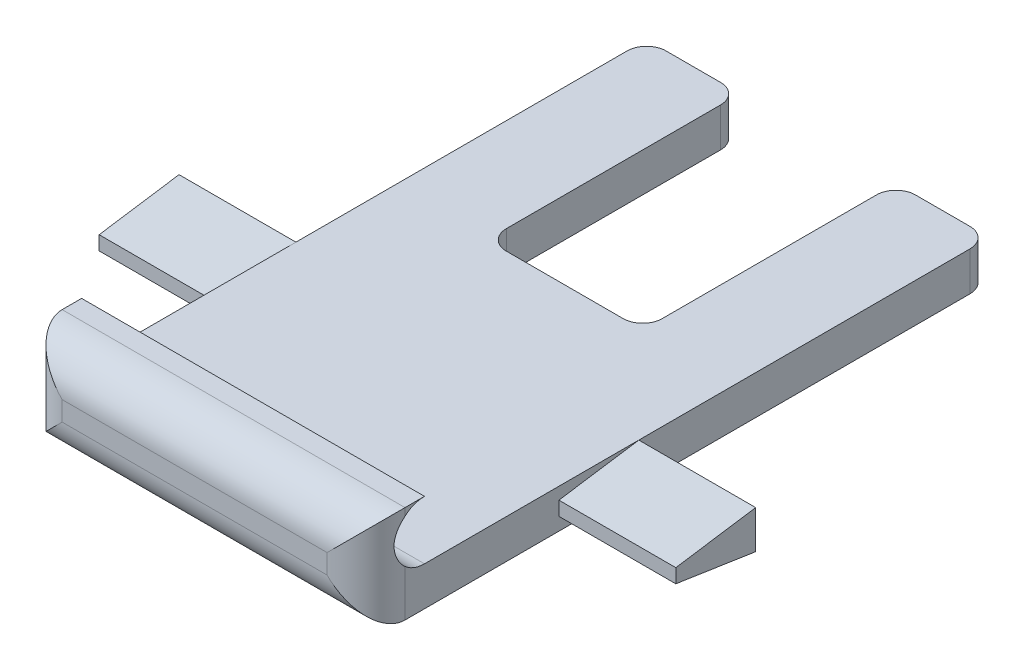
ISO-10303-21;
HEADER;
FILE_DESCRIPTION(('STEP AP214'),'2;1');
FILE_NAME('part.step','',(''),(''),'','','');
FILE_SCHEMA(('AUTOMOTIVE_DESIGN { 1 0 10303 214 1 1 1 1 }'));
ENDSEC;
DATA;
#1=APPLICATION_CONTEXT('core data for automotive mechanical design processes');
#2=APPLICATION_PROTOCOL_DEFINITION('international standard','automotive_design',2000,#1);
#3=PRODUCT_CONTEXT('',#1,'mechanical');
#4=PRODUCT('Part','Part','',(#3));
#5=PRODUCT_RELATED_PRODUCT_CATEGORY('part','',(#4));
#6=PRODUCT_DEFINITION_FORMATION('','',#4);
#7=PRODUCT_DEFINITION_CONTEXT('part definition',#1,'design');
#8=PRODUCT_DEFINITION('design','',#6,#7);
#9=PRODUCT_DEFINITION_SHAPE('','',#8);
#10=(LENGTH_UNIT() NAMED_UNIT(*) SI_UNIT(.MILLI.,.METRE.));
#11=(NAMED_UNIT(*) PLANE_ANGLE_UNIT() SI_UNIT($,.RADIAN.));
#12=(NAMED_UNIT(*) SI_UNIT($,.STERADIAN.) SOLID_ANGLE_UNIT());
#13=UNCERTAINTY_MEASURE_WITH_UNIT(LENGTH_MEASURE(1.E-05),#10,'distance_accuracy_value','');
#14=(GEOMETRIC_REPRESENTATION_CONTEXT(3) GLOBAL_UNCERTAINTY_ASSIGNED_CONTEXT((#13)) GLOBAL_UNIT_ASSIGNED_CONTEXT((#10,
#11,#12)) REPRESENTATION_CONTEXT('',''));
#15=CARTESIAN_POINT('',(0.,0.,0.));
#16=DIRECTION('',(0.,0.,1.));
#17=DIRECTION('',(1.,0.,0.));
#18=AXIS2_PLACEMENT_3D('',#15,#16,#17);
#19=CARTESIAN_POINT('',(0.,10.,0.));
#20=DIRECTION('',(1.,0.,0.));
#21=DIRECTION('',(0.,0.,-1.));
#22=AXIS2_PLACEMENT_3D('',#19,#20,#21);
#23=PLANE('',#22);
#24=DIRECTION('',(0.,0.149519617257155,-0.988758759281188));
#25=VECTOR('',#24,1.);
#26=CARTESIAN_POINT('',(0.,10.,-70.));
#27=LINE('',#26,#25);
#28=CARTESIAN_POINT('',(0.,6.9,-49.5));
#29=VERTEX_POINT('',#28);
#30=CARTESIAN_POINT('',(0.,10.,-70.));
#31=VERTEX_POINT('',#30);
#32=EDGE_CURVE('E228',#29,#31,#27,.T.);
#33=ORIENTED_EDGE('',*,*,#32,.F.);
#34=DIRECTION('',(0.,1.,0.));
#35=VECTOR('',#34,1.);
#36=CARTESIAN_POINT('',(0.,6.9,-49.5));
#37=LINE('',#36,#35);
#38=CARTESIAN_POINT('',(0.,3.3,-49.5));
#39=VERTEX_POINT('',#38);
#40=EDGE_CURVE('E262',#39,#29,#37,.T.);
#41=ORIENTED_EDGE('',*,*,#40,.F.);
#42=DIRECTION('',(0.,0.149519617257155,0.988758759281188));
#43=VECTOR('',#42,1.);
#44=CARTESIAN_POINT('',(0.,3.3,-49.5));
#45=LINE('',#44,#43);
#46=CARTESIAN_POINT('',(0.,0.200000000000001,-70.));
#47=VERTEX_POINT('',#46);
#48=EDGE_CURVE('E56',#47,#39,#45,.T.);
#49=ORIENTED_EDGE('',*,*,#48,.F.);
#50=DIRECTION('',(0.,-1.,0.));
#51=VECTOR('',#50,1.);
#52=CARTESIAN_POINT('',(0.,10.,-70.));
#53=LINE('',#52,#51);
#54=EDGE_CURVE('E271',#31,#47,#53,.T.);
#55=ORIENTED_EDGE('',*,*,#54,.F.);
#56=DIRECTION('',(0.,0.,1.));
#57=VECTOR('',#56,1.);
#58=CARTESIAN_POINT('',(0.,10.,0.));
#59=LINE('',#58,#57);
#60=CARTESIAN_POINT('',(0.,10.,-155.));
#61=VERTEX_POINT('',#60);
#62=EDGE_CURVE('E326',#61,#31,#59,.T.);
#63=ORIENTED_EDGE('',*,*,#62,.F.);
#64=DIRECTION('',(0.,-1.,0.));
#65=VECTOR('',#64,1.);
#66=CARTESIAN_POINT('',(0.,10.,-155.));
#67=LINE('',#66,#65);
#68=CARTESIAN_POINT('',(0.,0.,-155.));
#69=VERTEX_POINT('',#68);
#70=EDGE_CURVE('E41',#61,#69,#67,.T.);
#71=ORIENTED_EDGE('',*,*,#70,.T.);
#72=DIRECTION('',(0.,0.,1.));
#73=VECTOR('',#72,1.);
#74=CARTESIAN_POINT('',(0.,0.,0.));
#75=LINE('',#74,#73);
#76=CARTESIAN_POINT('',(0.,0.,-10.));
#77=VERTEX_POINT('',#76);
#78=EDGE_CURVE('E323',#69,#77,#75,.T.);
#79=ORIENTED_EDGE('',*,*,#78,.T.);
#80=DIRECTION('',(0.,-1.,0.));
#81=VECTOR('',#80,1.);
#82=CARTESIAN_POINT('',(0.,10.,-10.));
#83=LINE('',#82,#81);
#84=CARTESIAN_POINT('',(0.,11.9098300562505,-10.));
#85=VERTEX_POINT('',#84);
#86=EDGE_CURVE('E355',#77,#85,#83,.F.);
#87=ORIENTED_EDGE('',*,*,#86,.T.);
#88=CARTESIAN_POINT('',(0.,17.5,-15.));
#89=DIRECTION('',(1.,0.,0.));
#90=DIRECTION('',(0.,0.,-1.));
#91=AXIS2_PLACEMENT_3D('',#88,#89,#90);
#92=CIRCLE('',#91,7.5);
#93=CARTESIAN_POINT('',(0.,10.,-15.));
#94=VERTEX_POINT('',#93);
#95=EDGE_CURVE('E311',#94,#85,#92,.F.);
#96=ORIENTED_EDGE('',*,*,#95,.F.);
#97=EDGE_CURVE('E330',#31,#94,#59,.T.);
#98=ORIENTED_EDGE('',*,*,#97,.F.);
#99=EDGE_LOOP('',(#33,#41,#49,#55,#63,#71,#79,#87,#96,#98));
#100=FACE_BOUND('',#99,.T.);
#101=ADVANCED_FACE('F33',(#100),#23,.F.);
#102=CARTESIAN_POINT('',(0.,10.,-160.));
#103=DIRECTION('',(0.,0.,1.));
#104=DIRECTION('',(1.,0.,0.));
#105=AXIS2_PLACEMENT_3D('',#102,#103,#104);
#106=PLANE('',#105);
#107=DIRECTION('',(-1.,0.,0.));
#108=VECTOR('',#107,1.);
#109=CARTESIAN_POINT('',(0.,10.,-160.));
#110=LINE('',#109,#108);
#111=CARTESIAN_POINT('',(83.,10.,-160.));
#112=VERTEX_POINT('',#111);
#113=CARTESIAN_POINT('',(69.,10.,-160.));
#114=VERTEX_POINT('',#113);
#115=EDGE_CURVE('E335',#112,#114,#110,.T.);
#116=ORIENTED_EDGE('',*,*,#115,.F.);
#117=DIRECTION('',(0.,-1.,0.));
#118=VECTOR('',#117,1.);
#119=CARTESIAN_POINT('',(83.,10.,-160.));
#120=LINE('',#119,#118);
#121=CARTESIAN_POINT('',(83.,0.,-160.));
#122=VERTEX_POINT('',#121);
#123=EDGE_CURVE('E474',#112,#122,#120,.T.);
#124=ORIENTED_EDGE('',*,*,#123,.T.);
#125=DIRECTION('',(-1.,0.,0.));
#126=VECTOR('',#125,1.);
#127=CARTESIAN_POINT('',(0.,0.,-160.));
#128=LINE('',#127,#126);
#129=CARTESIAN_POINT('',(69.,0.,-160.));
#130=VERTEX_POINT('',#129);
#131=EDGE_CURVE('E343',#122,#130,#128,.T.);
#132=ORIENTED_EDGE('',*,*,#131,.T.);
#133=DIRECTION('',(0.,1.,0.));
#134=VECTOR('',#133,1.);
#135=CARTESIAN_POINT('',(69.,10.,-160.));
#136=LINE('',#135,#134);
#137=EDGE_CURVE('E511',#130,#114,#136,.T.);
#138=ORIENTED_EDGE('',*,*,#137,.T.);
#139=EDGE_LOOP('',(#116,#124,#132,#138));
#140=FACE_BOUND('',#139,.T.);
#141=ADVANCED_FACE('F405',(#140),#106,.F.);
#142=CARTESIAN_POINT('',(88.,10.,0.));
#143=DIRECTION('',(-1.,0.,0.));
#144=DIRECTION('',(0.,0.,1.));
#145=AXIS2_PLACEMENT_3D('',#142,#143,#144);
#146=PLANE('',#145);
#147=DIRECTION('',(0.,0.,-1.));
#148=VECTOR('',#147,1.);
#149=CARTESIAN_POINT('',(88.,25.,0.));
#150=LINE('',#149,#148);
#151=CARTESIAN_POINT('',(88.,25.,-10.));
#152=VERTEX_POINT('',#151);
#153=CARTESIAN_POINT('',(88.,25.,-15.));
#154=VERTEX_POINT('',#153);
#155=EDGE_CURVE('E318',#152,#154,#150,.T.);
#156=ORIENTED_EDGE('',*,*,#155,.F.);
#157=DIRECTION('',(0.,-1.,0.));
#158=VECTOR('',#157,1.);
#159=CARTESIAN_POINT('',(88.,10.,-10.));
#160=LINE('',#159,#158);
#161=CARTESIAN_POINT('',(88.,23.0901699437495,-10.));
#162=VERTEX_POINT('',#161);
#163=EDGE_CURVE('E526',#152,#162,#160,.T.);
#164=ORIENTED_EDGE('',*,*,#163,.T.);
#165=CARTESIAN_POINT('',(88.,17.5,-15.));
#166=DIRECTION('',(1.,0.,0.));
#167=DIRECTION('',(0.,0.,-1.));
#168=AXIS2_PLACEMENT_3D('',#165,#166,#167);
#169=CIRCLE('',#168,7.5);
#170=EDGE_CURVE('E306',#154,#162,#169,.T.);
#171=ORIENTED_EDGE('',*,*,#170,.F.);
#172=EDGE_LOOP('',(#156,#164,#171));
#173=FACE_BOUND('',#172,.T.);
#174=ADVANCED_FACE('F395',(#173),#146,.F.);
#175=CARTESIAN_POINT('',(0.,10.,0.));
#176=DIRECTION('',(0.,-1.,0.));
#177=DIRECTION('',(0.,0.,-1.));
#178=AXIS2_PLACEMENT_3D('',#175,#176,#177);
#179=PLANE('',#178);
#180=DIRECTION('',(0.,0.,-1.));
#181=VECTOR('',#180,1.);
#182=CARTESIAN_POINT('',(88.,10.,0.));
#183=LINE('',#182,#181);
#184=CARTESIAN_POINT('',(88.,10.,-15.));
#185=VERTEX_POINT('',#184);
#186=CARTESIAN_POINT('',(88.,10.,-70.));
#187=VERTEX_POINT('',#186);
#188=EDGE_CURVE('E331',#185,#187,#183,.T.);
#189=ORIENTED_EDGE('',*,*,#188,.T.);
#190=CARTESIAN_POINT('',(88.,10.,-155.));
#191=VERTEX_POINT('',#190);
#192=EDGE_CURVE('E329',#187,#191,#183,.T.);
#193=ORIENTED_EDGE('',*,*,#192,.T.);
#194=CARTESIAN_POINT('',(83.,10.,-155.));
#195=DIRECTION('',(0.,-1.,0.));
#196=DIRECTION('',(0.,0.,-1.));
#197=AXIS2_PLACEMENT_3D('',#194,#195,#196);
#198=CIRCLE('',#197,5.);
#199=EDGE_CURVE('E464',#191,#112,#198,.F.);
#200=ORIENTED_EDGE('',*,*,#199,.T.);
#201=ORIENTED_EDGE('',*,*,#115,.T.);
#202=CARTESIAN_POINT('',(69.,10.,-155.));
#203=DIRECTION('',(0.,-1.,0.));
#204=DIRECTION('',(0.,0.,-1.));
#205=AXIS2_PLACEMENT_3D('',#202,#203,#204);
#206=CIRCLE('',#205,5.);
#207=CARTESIAN_POINT('',(64.,10.,-155.));
#208=VERTEX_POINT('',#207);
#209=EDGE_CURVE('E507',#114,#208,#206,.F.);
#210=ORIENTED_EDGE('',*,*,#209,.T.);
#211=DIRECTION('',(0.,0.,1.));
#212=VECTOR('',#211,1.);
#213=CARTESIAN_POINT('',(64.,10.,-160.));
#214=LINE('',#213,#212);
#215=CARTESIAN_POINT('',(64.,10.,-100.));
#216=VERTEX_POINT('',#215);
#217=EDGE_CURVE('E293',#208,#216,#214,.T.);
#218=ORIENTED_EDGE('',*,*,#217,.T.);
#219=CARTESIAN_POINT('',(59.,9.99999999999999,-100.));
#220=DIRECTION('',(0.,-1.,0.));
#221=DIRECTION('',(0.,0.,-1.));
#222=AXIS2_PLACEMENT_3D('',#219,#220,#221);
#223=CIRCLE('',#222,5.);
#224=CARTESIAN_POINT('',(59.,10.,-95.));
#225=VERTEX_POINT('',#224);
#226=EDGE_CURVE('E479',#216,#225,#223,.T.);
#227=ORIENTED_EDGE('',*,*,#226,.T.);
#228=DIRECTION('',(1.,0.,0.));
#229=VECTOR('',#228,1.);
#230=CARTESIAN_POINT('',(24.,10.,-95.));
#231=LINE('',#230,#229);
#232=CARTESIAN_POINT('',(29.,10.,-95.));
#233=VERTEX_POINT('',#232);
#234=EDGE_CURVE('E292',#233,#225,#231,.T.);
#235=ORIENTED_EDGE('',*,*,#234,.F.);
#236=CARTESIAN_POINT('',(29.,9.99999999999999,-100.));
#237=DIRECTION('',(0.,-1.,0.));
#238=DIRECTION('',(0.,0.,-1.));
#239=AXIS2_PLACEMENT_3D('',#236,#237,#238);
#240=CIRCLE('',#239,5.);
#241=CARTESIAN_POINT('',(24.,10.,-100.));
#242=VERTEX_POINT('',#241);
#243=EDGE_CURVE('E483',#233,#242,#240,.T.);
#244=ORIENTED_EDGE('',*,*,#243,.T.);
#245=DIRECTION('',(0.,0.,1.));
#246=VECTOR('',#245,1.);
#247=CARTESIAN_POINT('',(24.,10.,-160.));
#248=LINE('',#247,#246);
#249=CARTESIAN_POINT('',(24.,10.,-155.));
#250=VERTEX_POINT('',#249);
#251=EDGE_CURVE('E288',#250,#242,#248,.T.);
#252=ORIENTED_EDGE('',*,*,#251,.F.);
#253=CARTESIAN_POINT('',(19.,9.99999999999999,-155.));
#254=DIRECTION('',(0.,-1.,0.));
#255=DIRECTION('',(0.,0.,-1.));
#256=AXIS2_PLACEMENT_3D('',#253,#254,#255);
#257=CIRCLE('',#256,5.);
#258=CARTESIAN_POINT('',(19.,10.,-160.));
#259=VERTEX_POINT('',#258);
#260=EDGE_CURVE('E509',#250,#259,#257,.F.);
#261=ORIENTED_EDGE('',*,*,#260,.T.);
#262=CARTESIAN_POINT('',(5.,10.,-160.));
#263=VERTEX_POINT('',#262);
#264=EDGE_CURVE('E334',#259,#263,#110,.T.);
#265=ORIENTED_EDGE('',*,*,#264,.T.);
#266=CARTESIAN_POINT('',(5.,10.,-155.));
#267=DIRECTION('',(0.,-1.,0.));
#268=DIRECTION('',(0.,0.,-1.));
#269=AXIS2_PLACEMENT_3D('',#266,#267,#268);
#270=CIRCLE('',#269,5.);
#271=EDGE_CURVE('E462',#263,#61,#270,.F.);
#272=ORIENTED_EDGE('',*,*,#271,.T.);
#273=ORIENTED_EDGE('',*,*,#62,.T.);
#274=ORIENTED_EDGE('',*,*,#97,.T.);
#275=DIRECTION('',(-1.,0.,0.));
#276=VECTOR('',#275,1.);
#277=CARTESIAN_POINT('',(0.,10.,-15.));
#278=LINE('',#277,#276);
#279=EDGE_CURVE('E314',#185,#94,#278,.T.);
#280=ORIENTED_EDGE('',*,*,#279,.F.);
#281=EDGE_LOOP('',(#189,#193,#200,#201,#210,#218,#227,#235,#244,#252,#261,#265,#272,#273,#274,#280));
#282=FACE_BOUND('',#281,.T.);
#283=ADVANCED_FACE('F391',(#282),#179,.F.);
#284=CARTESIAN_POINT('',(0.,23.0901699437495,-10.));
#285=VERTEX_POINT('',#284);
#286=CARTESIAN_POINT('',(0.,25.,-15.));
#287=VERTEX_POINT('',#286);
#288=EDGE_CURVE('E309',#285,#287,#92,.F.);
#289=ORIENTED_EDGE('',*,*,#288,.F.);
#290=DIRECTION('',(0.,-1.,0.));
#291=VECTOR('',#290,1.);
#292=CARTESIAN_POINT('',(0.,10.,-10.));
#293=LINE('',#292,#291);
#294=CARTESIAN_POINT('',(0.,25.,-10.));
#295=VERTEX_POINT('',#294);
#296=EDGE_CURVE('E353',#285,#295,#293,.F.);
#297=ORIENTED_EDGE('',*,*,#296,.T.);
#298=DIRECTION('',(0.,0.,1.));
#299=VECTOR('',#298,1.);
#300=CARTESIAN_POINT('',(0.,25.,0.));
#301=LINE('',#300,#299);
#302=EDGE_CURVE('E315',#287,#295,#301,.T.);
#303=ORIENTED_EDGE('',*,*,#302,.F.);
#304=EDGE_LOOP('',(#289,#297,#303));
#305=FACE_BOUND('',#304,.T.);
#306=ADVANCED_FACE('F394',(#305),#23,.F.);
#307=CARTESIAN_POINT('',(0.,10.,0.));
#308=DIRECTION('',(0.,0.,-1.));
#309=DIRECTION('',(-1.,0.,0.));
#310=AXIS2_PLACEMENT_3D('',#307,#308,#309);
#311=PLANE('',#310);
#312=DIRECTION('',(1.,0.,0.));
#313=VECTOR('',#312,1.);
#314=CARTESIAN_POINT('',(0.,15.,0.));
#315=LINE('',#314,#313);
#316=CARTESIAN_POINT('',(78.,15.,0.));
#317=VERTEX_POINT('',#316);
#318=CARTESIAN_POINT('',(10.,15.,0.));
#319=VERTEX_POINT('',#318);
#320=EDGE_CURVE('E348',#317,#319,#315,.F.);
#321=ORIENTED_EDGE('',*,*,#320,.T.);
#322=DIRECTION('',(0.,-1.,0.));
#323=VECTOR('',#322,1.);
#324=CARTESIAN_POINT('',(10.,10.,0.));
#325=LINE('',#324,#323);
#326=CARTESIAN_POINT('',(10.,10.,0.));
#327=VERTEX_POINT('',#326);
#328=EDGE_CURVE('E350',#319,#327,#325,.T.);
#329=ORIENTED_EDGE('',*,*,#328,.T.);
#330=DIRECTION('',(1.,0.,0.));
#331=VECTOR('',#330,1.);
#332=CARTESIAN_POINT('',(88.,10.,0.));
#333=LINE('',#332,#331);
#334=CARTESIAN_POINT('',(78.,10.,0.));
#335=VERTEX_POINT('',#334);
#336=EDGE_CURVE('E337',#327,#335,#333,.T.);
#337=ORIENTED_EDGE('',*,*,#336,.T.);
#338=DIRECTION('',(0.,-1.,0.));
#339=VECTOR('',#338,1.);
#340=CARTESIAN_POINT('',(78.,10.,0.));
#341=LINE('',#340,#339);
#342=EDGE_CURVE('E346',#335,#317,#341,.F.);
#343=ORIENTED_EDGE('',*,*,#342,.T.);
#344=EDGE_LOOP('',(#321,#329,#337,#343));
#345=FACE_BOUND('',#344,.T.);
#346=ADVANCED_FACE('F408',(#345),#311,.F.);
#347=DIRECTION('',(0.,1.,0.));
#348=VECTOR('',#347,1.);
#349=CARTESIAN_POINT('',(88.,6.9,-49.5));
#350=LINE('',#349,#348);
#351=CARTESIAN_POINT('',(88.,3.3,-49.5));
#352=VERTEX_POINT('',#351);
#353=CARTESIAN_POINT('',(88.,6.9,-49.5));
#354=VERTEX_POINT('',#353);
#355=EDGE_CURVE('E249',#352,#354,#350,.T.);
#356=ORIENTED_EDGE('',*,*,#355,.T.);
#357=DIRECTION('',(0.,0.149519617257155,-0.988758759281188));
#358=VECTOR('',#357,1.);
#359=CARTESIAN_POINT('',(88.,10.,-70.));
#360=LINE('',#359,#358);
#361=EDGE_CURVE('E223',#354,#187,#360,.T.);
#362=ORIENTED_EDGE('',*,*,#361,.T.);
#363=ORIENTED_EDGE('',*,*,#188,.F.);
#364=CARTESIAN_POINT('',(88.,11.9098300562505,-10.));
#365=VERTEX_POINT('',#364);
#366=EDGE_CURVE('E310',#365,#185,#169,.T.);
#367=ORIENTED_EDGE('',*,*,#366,.F.);
#368=DIRECTION('',(0.,-1.,0.));
#369=VECTOR('',#368,1.);
#370=CARTESIAN_POINT('',(88.,10.,-10.));
#371=LINE('',#370,#369);
#372=CARTESIAN_POINT('',(88.,0.,-10.));
#373=VERTEX_POINT('',#372);
#374=EDGE_CURVE('E528',#365,#373,#371,.T.);
#375=ORIENTED_EDGE('',*,*,#374,.T.);
#376=DIRECTION('',(0.,0.,-1.));
#377=VECTOR('',#376,1.);
#378=CARTESIAN_POINT('',(88.,0.,0.));
#379=LINE('',#378,#377);
#380=CARTESIAN_POINT('',(88.,0.,-155.));
#381=VERTEX_POINT('',#380);
#382=EDGE_CURVE('E339',#373,#381,#379,.T.);
#383=ORIENTED_EDGE('',*,*,#382,.T.);
#384=DIRECTION('',(0.,-1.,0.));
#385=VECTOR('',#384,1.);
#386=CARTESIAN_POINT('',(88.,10.,-155.));
#387=LINE('',#386,#385);
#388=EDGE_CURVE('E468',#381,#191,#387,.F.);
#389=ORIENTED_EDGE('',*,*,#388,.T.);
#390=ORIENTED_EDGE('',*,*,#192,.F.);
#391=DIRECTION('',(0.,-1.,0.));
#392=VECTOR('',#391,1.);
#393=CARTESIAN_POINT('',(88.,10.,-70.));
#394=LINE('',#393,#392);
#395=CARTESIAN_POINT('',(88.,0.199999999999999,-70.));
#396=VERTEX_POINT('',#395);
#397=EDGE_CURVE('E239',#187,#396,#394,.T.);
#398=ORIENTED_EDGE('',*,*,#397,.T.);
#399=DIRECTION('',(0.,0.149519617257155,0.988758759281188));
#400=VECTOR('',#399,1.);
#401=CARTESIAN_POINT('',(88.,3.3,-49.5));
#402=LINE('',#401,#400);
#403=EDGE_CURVE('E48',#396,#352,#402,.T.);
#404=ORIENTED_EDGE('',*,*,#403,.T.);
#405=EDGE_LOOP('',(#356,#362,#363,#367,#375,#383,#389,#390,#398,#404));
#406=FACE_BOUND('',#405,.T.);
#407=ADVANCED_FACE('F403',(#406),#146,.F.);
#408=CARTESIAN_POINT('',(19.,0.,-160.));
#409=VERTEX_POINT('',#408);
#410=CARTESIAN_POINT('',(5.,0.,-160.));
#411=VERTEX_POINT('',#410);
#412=EDGE_CURVE('E342',#409,#411,#128,.T.);
#413=ORIENTED_EDGE('',*,*,#412,.T.);
#414=DIRECTION('',(0.,-1.,0.));
#415=VECTOR('',#414,1.);
#416=CARTESIAN_POINT('',(5.,10.,-160.));
#417=LINE('',#416,#415);
#418=EDGE_CURVE('E11',#411,#263,#417,.F.);
#419=ORIENTED_EDGE('',*,*,#418,.T.);
#420=ORIENTED_EDGE('',*,*,#264,.F.);
#421=DIRECTION('',(0.,1.,0.));
#422=VECTOR('',#421,1.);
#423=CARTESIAN_POINT('',(19.,10.,-160.));
#424=LINE('',#423,#422);
#425=EDGE_CURVE('E490',#259,#409,#424,.F.);
#426=ORIENTED_EDGE('',*,*,#425,.T.);
#427=EDGE_LOOP('',(#413,#419,#420,#426));
#428=FACE_BOUND('',#427,.T.);
#429=ADVANCED_FACE('F399',(#428),#106,.F.);
#430=CARTESIAN_POINT('',(0.,0.,0.));
#431=DIRECTION('',(0.,-1.,0.));
#432=DIRECTION('',(0.,0.,-1.));
#433=AXIS2_PLACEMENT_3D('',#430,#431,#432);
#434=PLANE('',#433);
#435=ORIENTED_EDGE('',*,*,#131,.F.);
#436=CARTESIAN_POINT('',(83.,0.,-155.));
#437=DIRECTION('',(0.,-1.,0.));
#438=DIRECTION('',(0.,0.,-1.));
#439=AXIS2_PLACEMENT_3D('',#436,#437,#438);
#440=CIRCLE('',#439,5.);
#441=EDGE_CURVE('E471',#122,#381,#440,.T.);
#442=ORIENTED_EDGE('',*,*,#441,.T.);
#443=ORIENTED_EDGE('',*,*,#382,.F.);
#444=DIRECTION('',(1.,0.,0.));
#445=VECTOR('',#444,1.);
#446=CARTESIAN_POINT('',(0.,0.,-10.));
#447=LINE('',#446,#445);
#448=EDGE_CURVE('E514',#373,#77,#447,.F.);
#449=ORIENTED_EDGE('',*,*,#448,.T.);
#450=ORIENTED_EDGE('',*,*,#78,.F.);
#451=CARTESIAN_POINT('',(5.,0.,-155.));
#452=DIRECTION('',(0.,-1.,0.));
#453=DIRECTION('',(0.,0.,-1.));
#454=AXIS2_PLACEMENT_3D('',#451,#452,#453);
#455=CIRCLE('',#454,5.);
#456=EDGE_CURVE('E463',#69,#411,#455,.T.);
#457=ORIENTED_EDGE('',*,*,#456,.T.);
#458=ORIENTED_EDGE('',*,*,#412,.F.);
#459=CARTESIAN_POINT('',(19.,0.,-155.));
#460=DIRECTION('',(0.,-1.,0.));
#461=DIRECTION('',(0.,0.,-1.));
#462=AXIS2_PLACEMENT_3D('',#459,#460,#461);
#463=CIRCLE('',#462,5.);
#464=CARTESIAN_POINT('',(24.,0.,-155.));
#465=VERTEX_POINT('',#464);
#466=EDGE_CURVE('E500',#409,#465,#463,.T.);
#467=ORIENTED_EDGE('',*,*,#466,.T.);
#468=DIRECTION('',(0.,0.,1.));
#469=VECTOR('',#468,1.);
#470=CARTESIAN_POINT('',(24.,0.,-160.));
#471=LINE('',#470,#469);
#472=CARTESIAN_POINT('',(24.,0.,-100.));
#473=VERTEX_POINT('',#472);
#474=EDGE_CURVE('E296',#465,#473,#471,.T.);
#475=ORIENTED_EDGE('',*,*,#474,.T.);
#476=CARTESIAN_POINT('',(29.,0.,-100.));
#477=DIRECTION('',(0.,-1.,0.));
#478=DIRECTION('',(0.,0.,-1.));
#479=AXIS2_PLACEMENT_3D('',#476,#477,#478);
#480=CIRCLE('',#479,5.);
#481=CARTESIAN_POINT('',(29.,0.,-95.));
#482=VERTEX_POINT('',#481);
#483=EDGE_CURVE('E481',#473,#482,#480,.F.);
#484=ORIENTED_EDGE('',*,*,#483,.T.);
#485=DIRECTION('',(1.,0.,0.));
#486=VECTOR('',#485,1.);
#487=CARTESIAN_POINT('',(24.,0.,-95.));
#488=LINE('',#487,#486);
#489=CARTESIAN_POINT('',(59.,0.,-95.));
#490=VERTEX_POINT('',#489);
#491=EDGE_CURVE('E287',#482,#490,#488,.T.);
#492=ORIENTED_EDGE('',*,*,#491,.T.);
#493=CARTESIAN_POINT('',(59.,0.,-100.));
#494=DIRECTION('',(0.,-1.,0.));
#495=DIRECTION('',(0.,0.,-1.));
#496=AXIS2_PLACEMENT_3D('',#493,#494,#495);
#497=CIRCLE('',#496,5.);
#498=CARTESIAN_POINT('',(64.,0.,-100.));
#499=VERTEX_POINT('',#498);
#500=EDGE_CURVE('E477',#490,#499,#497,.F.);
#501=ORIENTED_EDGE('',*,*,#500,.T.);
#502=DIRECTION('',(0.,0.,1.));
#503=VECTOR('',#502,1.);
#504=CARTESIAN_POINT('',(64.,0.,-160.));
#505=LINE('',#504,#503);
#506=CARTESIAN_POINT('',(64.,0.,-155.));
#507=VERTEX_POINT('',#506);
#508=EDGE_CURVE('E291',#507,#499,#505,.T.);
#509=ORIENTED_EDGE('',*,*,#508,.F.);
#510=CARTESIAN_POINT('',(69.,0.,-155.));
#511=DIRECTION('',(0.,-1.,0.));
#512=DIRECTION('',(0.,0.,-1.));
#513=AXIS2_PLACEMENT_3D('',#510,#511,#512);
#514=CIRCLE('',#513,5.);
#515=EDGE_CURVE('E497',#507,#130,#514,.T.);
#516=ORIENTED_EDGE('',*,*,#515,.T.);
#517=EDGE_LOOP('',(#435,#442,#443,#449,#450,#457,#458,#467,#475,#484,#492,#501,#509,#516));
#518=FACE_BOUND('',#517,.T.);
#519=ADVANCED_FACE('F389',(#518),#434,.T.);
#520=CARTESIAN_POINT('',(0.,25.,0.));
#521=DIRECTION('',(0.,-1.,0.));
#522=DIRECTION('',(0.,0.,-1.));
#523=AXIS2_PLACEMENT_3D('',#520,#521,#522);
#524=PLANE('',#523);
#525=ORIENTED_EDGE('',*,*,#302,.T.);
#526=DIRECTION('',(1.,0.,0.));
#527=VECTOR('',#526,1.);
#528=CARTESIAN_POINT('',(0.,25.,-10.));
#529=LINE('',#528,#527);
#530=EDGE_CURVE('E529',#295,#152,#529,.T.);
#531=ORIENTED_EDGE('',*,*,#530,.T.);
#532=ORIENTED_EDGE('',*,*,#155,.T.);
#533=DIRECTION('',(-1.,0.,0.));
#534=VECTOR('',#533,1.);
#535=CARTESIAN_POINT('',(0.,25.,-15.));
#536=LINE('',#535,#534);
#537=EDGE_CURVE('E320',#154,#287,#536,.T.);
#538=ORIENTED_EDGE('',*,*,#537,.T.);
#539=EDGE_LOOP('',(#525,#531,#532,#538));
#540=FACE_BOUND('',#539,.T.);
#541=ADVANCED_FACE('F382',(#540),#524,.F.);
#542=CARTESIAN_POINT('',(-21.2132034355964,17.5,-15.));
#543=DIRECTION('',(1.,0.,0.));
#544=DIRECTION('',(0.,0.,-1.));
#545=AXIS2_PLACEMENT_3D('',#542,#543,#544);
#546=CYLINDRICAL_SURFACE('',#545,7.5);
#547=ORIENTED_EDGE('',*,*,#95,.T.);
#548=CARTESIAN_POINT('',(0.,11.9098300562505,-10.));
#549=CARTESIAN_POINT('',(-1.51159726218332E-06,12.0492075969304,-9.84413214464919));
#550=CARTESIAN_POINT('',(0.00364419094129561,12.1951018822746,-9.69417057794371));
#551=CARTESIAN_POINT('',(0.0165583455214132,12.4986886157814,-9.40711179956135));
#552=CARTESIAN_POINT('',(0.0258240970873527,12.6563753656928,-9.27000844592664));
#553=CARTESIAN_POINT('',(0.0483008264472678,12.9823165707053,-9.00967111010236));
#554=CARTESIAN_POINT('',(0.0615086233190128,13.1505624193222,-8.88642605532488));
#555=CARTESIAN_POINT('',(0.090251279169397,13.4966025378292,-8.65443485941519));
#556=CARTESIAN_POINT('',(0.105786392999787,13.6743978520597,-8.54569030862184));
#557=CARTESIAN_POINT('',(0.137624922139049,14.0381891245484,-8.34348929524267));
#558=CARTESIAN_POINT('',(0.153927597560968,14.2241771747563,-8.25001848311484));
#559=CARTESIAN_POINT('',(0.185892155604595,14.6033218652419,-8.07883555545085));
#560=CARTESIAN_POINT('',(0.201554044878231,14.7964784310644,-8.00112327629399));
#561=CARTESIAN_POINT('',(0.230966707074034,15.1886743031414,-7.86199917229895));
#562=CARTESIAN_POINT('',(0.244717888374576,15.3877123412779,-7.80058386172539));
#563=CARTESIAN_POINT('',(0.269246358359979,15.790383270992,-7.69448432695402));
#564=CARTESIAN_POINT('',(0.280023643517277,15.9940161680197,-7.64980012260224));
#565=CARTESIAN_POINT('',(0.297877434245224,16.4066012681782,-7.57714281586149));
#566=CARTESIAN_POINT('',(0.304914203396168,16.6155867898854,-7.54934871340111));
#567=CARTESIAN_POINT('',(0.314573073024439,17.0352605806161,-7.51144825623903));
#568=CARTESIAN_POINT('',(0.317195150133251,17.2459488586469,-7.50134199516527));
#569=CARTESIAN_POINT('',(0.317823521401564,17.6674158083523,-7.49890819627473));
#570=CARTESIAN_POINT('',(0.315830233183053,17.8781944701229,-7.50657904989327));
#571=CARTESIAN_POINT('',(0.307381360835107,18.2982649808147,-7.53962734579632));
#572=CARTESIAN_POINT('',(0.300925837390937,18.5075568499169,-7.56500454727906));
#573=CARTESIAN_POINT('',(0.284290999714169,18.9171657955648,-7.63226746171665));
#574=CARTESIAN_POINT('',(0.274223257410504,19.1175685111744,-7.67366119012821));
#575=CARTESIAN_POINT('',(0.25108329668385,19.5141522976537,-7.77262437105203));
#576=CARTESIAN_POINT('',(0.238011164456494,19.7103334894619,-7.83019335950831));
#577=CARTESIAN_POINT('',(0.209829915969303,20.0972744925897,-7.96111544474824));
#578=CARTESIAN_POINT('',(0.194720130285232,20.288032497203,-8.03447373348449));
#579=CARTESIAN_POINT('',(0.16363370881973,20.66287236618,-8.19647650600533));
#580=CARTESIAN_POINT('',(0.147657038802183,20.8469539663908,-8.28512159381753));
#581=CARTESIAN_POINT('',(0.114996734782941,21.2205528242792,-8.484210565295));
#582=CARTESIAN_POINT('',(0.0983473802203983,21.4094760526169,-8.59577741043317));
#583=CARTESIAN_POINT('',(0.0673466688606558,21.7769496296863,-8.83511623521543));
#584=CARTESIAN_POINT('',(0.0529951941339341,21.9555005104376,-8.9628873826348));
#585=CARTESIAN_POINT('',(0.0284559729101106,22.3011317694246,-9.233945296589));
#586=CARTESIAN_POINT('',(0.0182738152622639,22.4681965029739,-9.37725256571106));
#587=CARTESIAN_POINT('',(0.00404375095416997,22.7893118931326,-9.67818158461498));
#588=CARTESIAN_POINT('',(-1.25232302409011E-06,22.9433563575546,-9.83581007217099));
#589=CARTESIAN_POINT('',(0.,23.0901699437495,-10.));
#590=B_SPLINE_CURVE_WITH_KNOTS('',3,(#548,#549,#550,#551,#552,#553,#554,#555,#556,#557,#558,
#559,#560,#561,#562,#563,#564,#565,#566,#567,#568,#569,#570,#571,#572,#573,#574,#575,#576,#577,
#578,#579,#580,#581,#582,#583,#584,#585,#586,#587,#588,#589),.UNSPECIFIED.,.F.,.F.,(4,2,2,2,2,2,
2,2,2,2,2,2,2,2,2,2,2,2,2,2,4),(0.,0.626988220207246,1.25367540629026,1.87985826574734,
2.50610974525388,3.13176944159976,3.75742264139506,4.38294191305773,5.00846192669319,
5.64050051820513,6.27254245530873,6.90452720424278,7.53650335851409,8.15043724393108,
8.76435351784747,9.37847197343513,9.99261470026063,10.6518712154981,11.3110938861712,
11.971197355588,12.6316130114306),.UNSPECIFIED.);
#591=EDGE_CURVE('E366',#85,#285,#590,.T.);
#592=ORIENTED_EDGE('',*,*,#591,.T.);
#593=ORIENTED_EDGE('',*,*,#288,.T.);
#594=ORIENTED_EDGE('',*,*,#537,.F.);
#595=ORIENTED_EDGE('',*,*,#170,.T.);
#596=CARTESIAN_POINT('',(88.,23.0901699437495,-10.));
#597=CARTESIAN_POINT('',(88.0000015115973,22.9507924030696,-9.84413214464919));
#598=CARTESIAN_POINT('',(87.9963558090587,22.8048981177254,-9.69417057794371));
#599=CARTESIAN_POINT('',(87.9834416544786,22.5013113842186,-9.40711179956135));
#600=CARTESIAN_POINT('',(87.9741759029126,22.3436246343072,-9.27000844592664));
#601=CARTESIAN_POINT('',(87.9516991735527,22.0176834292947,-9.00967111010236));
#602=CARTESIAN_POINT('',(87.938491376681,21.8494375806778,-8.88642605532488));
#603=CARTESIAN_POINT('',(87.9097487208306,21.5033974621708,-8.65443485941519));
#604=CARTESIAN_POINT('',(87.8942136070002,21.3256021479403,-8.54569030862184));
#605=CARTESIAN_POINT('',(87.862375077861,20.9618108754516,-8.34348929524267));
#606=CARTESIAN_POINT('',(87.846072402439,20.7758228252438,-8.25001848311484));
#607=CARTESIAN_POINT('',(87.8141078443954,20.3966781347581,-8.07883555545085));
#608=CARTESIAN_POINT('',(87.7984459551218,20.2035215689356,-8.001123276294));
#609=CARTESIAN_POINT('',(87.769033292926,19.8113256968586,-7.86199917229895));
#610=CARTESIAN_POINT('',(87.7552821116254,19.6122876587221,-7.80058386172539));
#611=CARTESIAN_POINT('',(87.73075364164,19.209616729008,-7.69448432695402));
#612=CARTESIAN_POINT('',(87.7199763564827,19.0059838319803,-7.64980012260224));
#613=CARTESIAN_POINT('',(87.7021225657548,18.5933987318218,-7.57714281586149));
#614=CARTESIAN_POINT('',(87.6950857966038,18.3844132101146,-7.54934871340111));
#615=CARTESIAN_POINT('',(87.6854269269756,17.9647394193839,-7.51144825623903));
#616=CARTESIAN_POINT('',(87.6828048498668,17.7540511413531,-7.50134199516527));
#617=CARTESIAN_POINT('',(87.6821764785984,17.3325841916477,-7.49890819627473));
#618=CARTESIAN_POINT('',(87.684169766817,17.1218055298771,-7.50657904989327));
#619=CARTESIAN_POINT('',(87.6926186391649,16.7017350191853,-7.53962734579632));
#620=CARTESIAN_POINT('',(87.6990741626091,16.4924431500831,-7.56500454727906));
#621=CARTESIAN_POINT('',(87.7157090002858,16.0828342044352,-7.63226746171665));
#622=CARTESIAN_POINT('',(87.7257767425895,15.8824314888256,-7.67366119012821));
#623=CARTESIAN_POINT('',(87.7489167033162,15.4858477023463,-7.77262437105203));
#624=CARTESIAN_POINT('',(87.7619888355435,15.2896665105381,-7.83019335950831));
#625=CARTESIAN_POINT('',(87.7901700840307,14.9027255074103,-7.96111544474824));
#626=CARTESIAN_POINT('',(87.8052798697148,14.711967502797,-8.03447373348449));
#627=CARTESIAN_POINT('',(87.8363662911803,14.33712763382,-8.19647650600533));
#628=CARTESIAN_POINT('',(87.8523429611978,14.1530460336092,-8.28512159381753));
#629=CARTESIAN_POINT('',(87.8850032652171,13.7794471757208,-8.484210565295));
#630=CARTESIAN_POINT('',(87.9016526197796,13.5905239473831,-8.59577741043317));
#631=CARTESIAN_POINT('',(87.9326533311393,13.2230503703137,-8.83511623521543));
#632=CARTESIAN_POINT('',(87.9470048058661,13.0444994895624,-8.9628873826348));
#633=CARTESIAN_POINT('',(87.9715440270899,12.6988682305754,-9.233945296589));
#634=CARTESIAN_POINT('',(87.9817261847377,12.5318034970261,-9.37725256571106));
#635=CARTESIAN_POINT('',(87.9959562490458,12.2106881068674,-9.67818158461498));
#636=CARTESIAN_POINT('',(88.000001252323,12.0566436424454,-9.83581007217099));
#637=CARTESIAN_POINT('',(88.,11.9098300562505,-10.));
#638=B_SPLINE_CURVE_WITH_KNOTS('',3,(#596,#597,#598,#599,#600,#601,#602,#603,#604,#605,#606,
#607,#608,#609,#610,#611,#612,#613,#614,#615,#616,#617,#618,#619,#620,#621,#622,#623,#624,#625,
#626,#627,#628,#629,#630,#631,#632,#633,#634,#635,#636,#637),.UNSPECIFIED.,.F.,.F.,(4,2,2,2,2,2,
2,2,2,2,2,2,2,2,2,2,2,2,2,2,4),(0.,0.626988220207245,1.25367540629026,1.87985826574734,
2.50610974525388,3.13176944159975,3.75742264139505,4.38294191305773,5.00846192669319,
5.64050051820513,6.27254245530872,6.90452720424278,7.53650335851408,8.15043724393108,
8.76435351784746,9.37847197343514,9.99261470026062,10.6518712154981,11.3110938861712,
11.971197355588,12.6316130114306),.UNSPECIFIED.);
#639=EDGE_CURVE('E358',#162,#365,#638,.T.);
#640=ORIENTED_EDGE('',*,*,#639,.T.);
#641=ORIENTED_EDGE('',*,*,#366,.T.);
#642=ORIENTED_EDGE('',*,*,#279,.T.);
#643=EDGE_LOOP('',(#547,#592,#593,#594,#595,#640,#641,#642));
#644=FACE_BOUND('',#643,.T.);
#645=ADVANCED_FACE('F377',(#644),#546,.F.);
#646=CARTESIAN_POINT('',(78.,10.,-10.));
#647=DIRECTION('',(0.,-1.,0.));
#648=DIRECTION('',(0.,0.,-1.));
#649=AXIS2_PLACEMENT_3D('',#646,#647,#648);
#650=CYLINDRICAL_SURFACE('',#649,10.);
#651=ORIENTED_EDGE('',*,*,#639,.F.);
#652=ORIENTED_EDGE('',*,*,#163,.F.);
#653=CARTESIAN_POINT('',(78.,15.,-10.));
#654=DIRECTION('',(0.707106781186547,-0.707106781186547,0.));
#655=DIRECTION('',(-0.707106781186547,-0.707106781186547,0.));
#656=AXIS2_PLACEMENT_3D('',#653,#654,#655);
#657=ELLIPSE('',#656,14.1421356237309,10.);
#658=EDGE_CURVE('E515',#317,#152,#657,.F.);
#659=ORIENTED_EDGE('',*,*,#658,.F.);
#660=ORIENTED_EDGE('',*,*,#342,.F.);
#661=CARTESIAN_POINT('',(78.,10.,-10.));
#662=DIRECTION('',(-0.707106781186547,-0.707106781186547,0.));
#663=DIRECTION('',(-0.707106781186547,0.707106781186547,0.));
#664=AXIS2_PLACEMENT_3D('',#661,#662,#663);
#665=ELLIPSE('',#664,14.1421356237309,10.);
#666=EDGE_CURVE('E517',#373,#335,#665,.T.);
#667=ORIENTED_EDGE('',*,*,#666,.F.);
#668=ORIENTED_EDGE('',*,*,#374,.F.);
#669=EDGE_LOOP('',(#651,#652,#659,#660,#667,#668));
#670=FACE_BOUND('',#669,.T.);
#671=ADVANCED_FACE('F373',(#670),#650,.T.);
#672=CARTESIAN_POINT('',(0.,15.,-10.));
#673=DIRECTION('',(1.,0.,0.));
#674=DIRECTION('',(0.,0.,-1.));
#675=AXIS2_PLACEMENT_3D('',#672,#673,#674);
#676=CYLINDRICAL_SURFACE('',#675,10.);
#677=ORIENTED_EDGE('',*,*,#658,.T.);
#678=ORIENTED_EDGE('',*,*,#530,.F.);
#679=CARTESIAN_POINT('',(10.,15.,-10.));
#680=DIRECTION('',(0.707106781186547,0.707106781186547,0.));
#681=DIRECTION('',(0.707106781186547,-0.707106781186547,0.));
#682=AXIS2_PLACEMENT_3D('',#679,#680,#681);
#683=ELLIPSE('',#682,14.1421356237309,10.);
#684=EDGE_CURVE('E520',#319,#295,#683,.F.);
#685=ORIENTED_EDGE('',*,*,#684,.F.);
#686=ORIENTED_EDGE('',*,*,#320,.F.);
#687=EDGE_LOOP('',(#677,#678,#685,#686));
#688=FACE_BOUND('',#687,.T.);
#689=ADVANCED_FACE('F422',(#688),#676,.T.);
#690=CARTESIAN_POINT('',(0.,10.,-10.));
#691=DIRECTION('',(-1.,0.,0.));
#692=DIRECTION('',(0.,0.,1.));
#693=AXIS2_PLACEMENT_3D('',#690,#691,#692);
#694=CYLINDRICAL_SURFACE('',#693,10.);
#695=ORIENTED_EDGE('',*,*,#666,.T.);
#696=ORIENTED_EDGE('',*,*,#336,.F.);
#697=CARTESIAN_POINT('',(10.,10.,-10.));
#698=DIRECTION('',(-0.707106781186547,0.707106781186547,0.));
#699=DIRECTION('',(-0.707106781186547,-0.707106781186547,0.));
#700=AXIS2_PLACEMENT_3D('',#697,#698,#699);
#701=ELLIPSE('',#700,14.1421356237309,10.);
#702=EDGE_CURVE('E305',#77,#327,#701,.T.);
#703=ORIENTED_EDGE('',*,*,#702,.F.);
#704=ORIENTED_EDGE('',*,*,#448,.F.);
#705=EDGE_LOOP('',(#695,#696,#703,#704));
#706=FACE_BOUND('',#705,.T.);
#707=ADVANCED_FACE('F419',(#706),#694,.T.);
#708=CARTESIAN_POINT('',(10.,10.,-10.));
#709=DIRECTION('',(0.,-1.,0.));
#710=DIRECTION('',(0.,0.,-1.));
#711=AXIS2_PLACEMENT_3D('',#708,#709,#710);
#712=CYLINDRICAL_SURFACE('',#711,10.);
#713=ORIENTED_EDGE('',*,*,#591,.F.);
#714=ORIENTED_EDGE('',*,*,#86,.F.);
#715=ORIENTED_EDGE('',*,*,#702,.T.);
#716=ORIENTED_EDGE('',*,*,#328,.F.);
#717=ORIENTED_EDGE('',*,*,#684,.T.);
#718=ORIENTED_EDGE('',*,*,#296,.F.);
#719=EDGE_LOOP('',(#713,#714,#715,#716,#717,#718));
#720=FACE_BOUND('',#719,.T.);
#721=ADVANCED_FACE('F415',(#720),#712,.T.);
#722=CARTESIAN_POINT('',(24.,-76.3216876123687,-95.));
#723=DIRECTION('',(0.,0.,1.));
#724=DIRECTION('',(1.,0.,0.));
#725=AXIS2_PLACEMENT_3D('',#722,#723,#724);
#726=PLANE('',#725);
#727=ORIENTED_EDGE('',*,*,#491,.F.);
#728=DIRECTION('',(0.,1.,0.));
#729=VECTOR('',#728,1.);
#730=CARTESIAN_POINT('',(29.,9.99999999999999,-95.));
#731=LINE('',#730,#729);
#732=EDGE_CURVE('E485',#482,#233,#731,.T.);
#733=ORIENTED_EDGE('',*,*,#732,.T.);
#734=ORIENTED_EDGE('',*,*,#234,.T.);
#735=DIRECTION('',(0.,1.,0.));
#736=VECTOR('',#735,1.);
#737=CARTESIAN_POINT('',(59.,-76.3216876123687,-95.));
#738=LINE('',#737,#736);
#739=EDGE_CURVE('E488',#225,#490,#738,.F.);
#740=ORIENTED_EDGE('',*,*,#739,.T.);
#741=EDGE_LOOP('',(#727,#733,#734,#740));
#742=FACE_BOUND('',#741,.T.);
#743=ADVANCED_FACE('F384',(#742),#726,.F.);
#744=CARTESIAN_POINT('',(24.,-76.3216876123687,-160.));
#745=DIRECTION('',(-1.,0.,0.));
#746=DIRECTION('',(0.,0.,1.));
#747=AXIS2_PLACEMENT_3D('',#744,#745,#746);
#748=PLANE('',#747);
#749=ORIENTED_EDGE('',*,*,#474,.F.);
#750=DIRECTION('',(0.,1.,0.));
#751=VECTOR('',#750,1.);
#752=CARTESIAN_POINT('',(24.,-76.3216876123687,-155.));
#753=LINE('',#752,#751);
#754=EDGE_CURVE('E492',#465,#250,#753,.T.);
#755=ORIENTED_EDGE('',*,*,#754,.T.);
#756=ORIENTED_EDGE('',*,*,#251,.T.);
#757=DIRECTION('',(0.,1.,0.));
#758=VECTOR('',#757,1.);
#759=CARTESIAN_POINT('',(24.,0.,-100.));
#760=LINE('',#759,#758);
#761=EDGE_CURVE('E495',#242,#473,#760,.F.);
#762=ORIENTED_EDGE('',*,*,#761,.T.);
#763=EDGE_LOOP('',(#749,#755,#756,#762));
#764=FACE_BOUND('',#763,.T.);
#765=ADVANCED_FACE('F589',(#764),#748,.F.);
#766=CARTESIAN_POINT('',(64.,-76.3216876123687,-160.));
#767=DIRECTION('',(-1.,0.,0.));
#768=DIRECTION('',(0.,0.,1.));
#769=AXIS2_PLACEMENT_3D('',#766,#767,#768);
#770=PLANE('',#769);
#771=ORIENTED_EDGE('',*,*,#217,.F.);
#772=DIRECTION('',(0.,1.,0.));
#773=VECTOR('',#772,1.);
#774=CARTESIAN_POINT('',(64.,0.,-155.));
#775=LINE('',#774,#773);
#776=EDGE_CURVE('E502',#208,#507,#775,.F.);
#777=ORIENTED_EDGE('',*,*,#776,.T.);
#778=ORIENTED_EDGE('',*,*,#508,.T.);
#779=DIRECTION('',(0.,1.,0.));
#780=VECTOR('',#779,1.);
#781=CARTESIAN_POINT('',(64.,-76.3216876123687,-100.));
#782=LINE('',#781,#780);
#783=EDGE_CURVE('E504',#499,#216,#782,.T.);
#784=ORIENTED_EDGE('',*,*,#783,.T.);
#785=EDGE_LOOP('',(#771,#777,#778,#784));
#786=FACE_BOUND('',#785,.T.);
#787=ADVANCED_FACE('F571',(#786),#770,.T.);
#788=CARTESIAN_POINT('',(69.,10.,-155.));
#789=DIRECTION('',(0.,-1.,0.));
#790=DIRECTION('',(0.,0.,-1.));
#791=AXIS2_PLACEMENT_3D('',#788,#789,#790);
#792=CYLINDRICAL_SURFACE('',#791,5.);
#793=ORIENTED_EDGE('',*,*,#515,.F.);
#794=ORIENTED_EDGE('',*,*,#776,.F.);
#795=ORIENTED_EDGE('',*,*,#209,.F.);
#796=ORIENTED_EDGE('',*,*,#137,.F.);
#797=EDGE_LOOP('',(#793,#794,#795,#796));
#798=FACE_BOUND('',#797,.T.);
#799=ADVANCED_FACE('F567',(#798),#792,.T.);
#800=CARTESIAN_POINT('',(19.,-76.3216876123687,-155.));
#801=DIRECTION('',(0.,1.,0.));
#802=DIRECTION('',(0.,0.,1.));
#803=AXIS2_PLACEMENT_3D('',#800,#801,#802);
#804=CYLINDRICAL_SURFACE('',#803,5.);
#805=ORIENTED_EDGE('',*,*,#466,.F.);
#806=ORIENTED_EDGE('',*,*,#425,.F.);
#807=ORIENTED_EDGE('',*,*,#260,.F.);
#808=ORIENTED_EDGE('',*,*,#754,.F.);
#809=EDGE_LOOP('',(#805,#806,#807,#808));
#810=FACE_BOUND('',#809,.T.);
#811=ADVANCED_FACE('F593',(#810),#804,.T.);
#812=CARTESIAN_POINT('',(29.,-76.3216876123687,-100.));
#813=DIRECTION('',(0.,-1.,0.));
#814=DIRECTION('',(0.,0.,-1.));
#815=AXIS2_PLACEMENT_3D('',#812,#813,#814);
#816=CYLINDRICAL_SURFACE('',#815,5.);
#817=ORIENTED_EDGE('',*,*,#483,.F.);
#818=ORIENTED_EDGE('',*,*,#761,.F.);
#819=ORIENTED_EDGE('',*,*,#243,.F.);
#820=ORIENTED_EDGE('',*,*,#732,.F.);
#821=EDGE_LOOP('',(#817,#818,#819,#820));
#822=FACE_BOUND('',#821,.T.);
#823=ADVANCED_FACE('F584',(#822),#816,.F.);
#824=CARTESIAN_POINT('',(59.,-76.3216876123687,-100.));
#825=DIRECTION('',(0.,1.,0.));
#826=DIRECTION('',(0.,0.,1.));
#827=AXIS2_PLACEMENT_3D('',#824,#825,#826);
#828=CYLINDRICAL_SURFACE('',#827,5.);
#829=ORIENTED_EDGE('',*,*,#500,.F.);
#830=ORIENTED_EDGE('',*,*,#739,.F.);
#831=ORIENTED_EDGE('',*,*,#226,.F.);
#832=ORIENTED_EDGE('',*,*,#783,.F.);
#833=EDGE_LOOP('',(#829,#830,#831,#832));
#834=FACE_BOUND('',#833,.T.);
#835=ADVANCED_FACE('F576',(#834),#828,.F.);
#836=CARTESIAN_POINT('',(83.,10.,-155.));
#837=DIRECTION('',(0.,-1.,0.));
#838=DIRECTION('',(0.,0.,-1.));
#839=AXIS2_PLACEMENT_3D('',#836,#837,#838);
#840=CYLINDRICAL_SURFACE('',#839,5.);
#841=ORIENTED_EDGE('',*,*,#199,.F.);
#842=ORIENTED_EDGE('',*,*,#388,.F.);
#843=ORIENTED_EDGE('',*,*,#441,.F.);
#844=ORIENTED_EDGE('',*,*,#123,.F.);
#845=EDGE_LOOP('',(#841,#842,#843,#844));
#846=FACE_BOUND('',#845,.T.);
#847=ADVANCED_FACE('F560',(#846),#840,.T.);
#848=CARTESIAN_POINT('',(5.,10.,-155.));
#849=DIRECTION('',(0.,-1.,0.));
#850=DIRECTION('',(0.,0.,-1.));
#851=AXIS2_PLACEMENT_3D('',#848,#849,#850);
#852=CYLINDRICAL_SURFACE('',#851,5.);
#853=ORIENTED_EDGE('',*,*,#271,.F.);
#854=ORIENTED_EDGE('',*,*,#418,.F.);
#855=ORIENTED_EDGE('',*,*,#456,.F.);
#856=ORIENTED_EDGE('',*,*,#70,.F.);
#857=EDGE_LOOP('',(#853,#854,#855,#856));
#858=FACE_BOUND('',#857,.T.);
#859=ADVANCED_FACE('F35',(#858),#852,.T.);
#860=CARTESIAN_POINT('',(-30.,10.,-70.));
#861=DIRECTION('',(0.,-0.988758759281188,-0.149519617257155));
#862=DIRECTION('',(0.,0.149519617257155,-0.988758759281188));
#863=AXIS2_PLACEMENT_3D('',#860,#861,#862);
#864=PLANE('',#863);
#865=ORIENTED_EDGE('',*,*,#32,.T.);
#866=DIRECTION('',(1.,0.,0.));
#867=VECTOR('',#866,1.);
#868=CARTESIAN_POINT('',(-30.,10.,-70.));
#869=LINE('',#868,#867);
#870=CARTESIAN_POINT('',(-30.,10.,-70.));
#871=VERTEX_POINT('',#870);
#872=EDGE_CURVE('E284',#871,#31,#869,.T.);
#873=ORIENTED_EDGE('',*,*,#872,.F.);
#874=DIRECTION('',(0.,0.149519617257155,-0.988758759281188));
#875=VECTOR('',#874,1.);
#876=CARTESIAN_POINT('',(-30.,10.,-70.));
#877=LINE('',#876,#875);
#878=CARTESIAN_POINT('',(-30.,6.9,-49.5));
#879=VERTEX_POINT('',#878);
#880=EDGE_CURVE('E258',#879,#871,#877,.T.);
#881=ORIENTED_EDGE('',*,*,#880,.F.);
#882=DIRECTION('',(1.,0.,0.));
#883=VECTOR('',#882,1.);
#884=CARTESIAN_POINT('',(-30.,6.9,-49.5));
#885=LINE('',#884,#883);
#886=EDGE_CURVE('E268',#879,#29,#885,.T.);
#887=ORIENTED_EDGE('',*,*,#886,.T.);
#888=EDGE_LOOP('',(#865,#873,#881,#887));
#889=FACE_BOUND('',#888,.T.);
#890=ADVANCED_FACE('F446',(#889),#864,.F.);
#891=CARTESIAN_POINT('',(-30.,10.,-70.));
#892=DIRECTION('',(0.,0.,1.));
#893=DIRECTION('',(1.,0.,0.));
#894=AXIS2_PLACEMENT_3D('',#891,#892,#893);
#895=PLANE('',#894);
#896=ORIENTED_EDGE('',*,*,#54,.T.);
#897=DIRECTION('',(1.,0.,0.));
#898=VECTOR('',#897,1.);
#899=CARTESIAN_POINT('',(-30.,0.199999999999999,-70.));
#900=LINE('',#899,#898);
#901=CARTESIAN_POINT('',(-30.,0.199999999999999,-70.));
#902=VERTEX_POINT('',#901);
#903=EDGE_CURVE('E281',#902,#47,#900,.T.);
#904=ORIENTED_EDGE('',*,*,#903,.F.);
#905=DIRECTION('',(0.,-1.,0.));
#906=VECTOR('',#905,1.);
#907=CARTESIAN_POINT('',(-30.,10.,-70.));
#908=LINE('',#907,#906);
#909=EDGE_CURVE('E261',#871,#902,#908,.T.);
#910=ORIENTED_EDGE('',*,*,#909,.F.);
#911=ORIENTED_EDGE('',*,*,#872,.T.);
#912=EDGE_LOOP('',(#896,#904,#910,#911));
#913=FACE_BOUND('',#912,.T.);
#914=ADVANCED_FACE('F454',(#913),#895,.F.);
#915=CARTESIAN_POINT('',(-30.,3.3,-49.5));
#916=DIRECTION('',(0.,0.988758759281188,-0.149519617257155));
#917=DIRECTION('',(0.,0.149519617257155,0.988758759281188));
#918=AXIS2_PLACEMENT_3D('',#915,#916,#917);
#919=PLANE('',#918);
#920=ORIENTED_EDGE('',*,*,#48,.T.);
#921=DIRECTION('',(1.,0.,0.));
#922=VECTOR('',#921,1.);
#923=CARTESIAN_POINT('',(-30.,3.3,-49.5));
#924=LINE('',#923,#922);
#925=CARTESIAN_POINT('',(-30.,3.3,-49.5));
#926=VERTEX_POINT('',#925);
#927=EDGE_CURVE('E278',#926,#39,#924,.T.);
#928=ORIENTED_EDGE('',*,*,#927,.F.);
#929=DIRECTION('',(0.,0.149519617257155,0.988758759281188));
#930=VECTOR('',#929,1.);
#931=CARTESIAN_POINT('',(-30.,3.3,-49.5));
#932=LINE('',#931,#930);
#933=EDGE_CURVE('E264',#902,#926,#932,.T.);
#934=ORIENTED_EDGE('',*,*,#933,.F.);
#935=ORIENTED_EDGE('',*,*,#903,.T.);
#936=EDGE_LOOP('',(#920,#928,#934,#935));
#937=FACE_BOUND('',#936,.T.);
#938=ADVANCED_FACE('F452',(#937),#919,.F.);
#939=CARTESIAN_POINT('',(-30.,6.9,-49.5));
#940=DIRECTION('',(0.,0.,-1.));
#941=DIRECTION('',(-1.,0.,0.));
#942=AXIS2_PLACEMENT_3D('',#939,#940,#941);
#943=PLANE('',#942);
#944=ORIENTED_EDGE('',*,*,#40,.T.);
#945=ORIENTED_EDGE('',*,*,#886,.F.);
#946=DIRECTION('',(0.,1.,0.));
#947=VECTOR('',#946,1.);
#948=CARTESIAN_POINT('',(-30.,6.9,-49.5));
#949=LINE('',#948,#947);
#950=EDGE_CURVE('E266',#926,#879,#949,.T.);
#951=ORIENTED_EDGE('',*,*,#950,.F.);
#952=ORIENTED_EDGE('',*,*,#927,.T.);
#953=EDGE_LOOP('',(#944,#945,#951,#952));
#954=FACE_BOUND('',#953,.T.);
#955=ADVANCED_FACE('F442',(#954),#943,.F.);
#956=CARTESIAN_POINT('',(-30.,0.,0.));
#957=DIRECTION('',(1.,0.,0.));
#958=DIRECTION('',(0.,0.,-1.));
#959=AXIS2_PLACEMENT_3D('',#956,#957,#958);
#960=PLANE('',#959);
#961=ORIENTED_EDGE('',*,*,#880,.T.);
#962=ORIENTED_EDGE('',*,*,#909,.T.);
#963=ORIENTED_EDGE('',*,*,#933,.T.);
#964=ORIENTED_EDGE('',*,*,#950,.T.);
#965=EDGE_LOOP('',(#961,#962,#963,#964));
#966=FACE_BOUND('',#965,.T.);
#967=ADVANCED_FACE('F448',(#966),#960,.F.);
#968=CARTESIAN_POINT('',(118.,10.,-70.));
#969=DIRECTION('',(0.,0.988758759281188,0.149519617257155));
#970=DIRECTION('',(0.,-0.149519617257155,0.988758759281188));
#971=AXIS2_PLACEMENT_3D('',#968,#969,#970);
#972=PLANE('',#971);
#973=ORIENTED_EDGE('',*,*,#361,.F.);
#974=DIRECTION('',(-1.,0.,0.));
#975=VECTOR('',#974,1.);
#976=CARTESIAN_POINT('',(118.,6.9,-49.5));
#977=LINE('',#976,#975);
#978=CARTESIAN_POINT('',(118.,6.9,-49.5));
#979=VERTEX_POINT('',#978);
#980=EDGE_CURVE('E217',#979,#354,#977,.T.);
#981=ORIENTED_EDGE('',*,*,#980,.F.);
#982=DIRECTION('',(0.,0.149519617257155,-0.988758759281188));
#983=VECTOR('',#982,1.);
#984=CARTESIAN_POINT('',(118.,10.,-70.));
#985=LINE('',#984,#983);
#986=CARTESIAN_POINT('',(118.,10.,-70.));
#987=VERTEX_POINT('',#986);
#988=EDGE_CURVE('E220',#979,#987,#985,.T.);
#989=ORIENTED_EDGE('',*,*,#988,.T.);
#990=DIRECTION('',(-1.,0.,0.));
#991=VECTOR('',#990,1.);
#992=CARTESIAN_POINT('',(118.,10.,-70.));
#993=LINE('',#992,#991);
#994=EDGE_CURVE('E247',#987,#187,#993,.T.);
#995=ORIENTED_EDGE('',*,*,#994,.T.);
#996=EDGE_LOOP('',(#973,#981,#989,#995));
#997=FACE_BOUND('',#996,.T.);
#998=ADVANCED_FACE('F219',(#997),#972,.T.);
#999=CARTESIAN_POINT('',(118.,6.9,-49.5));
#1000=DIRECTION('',(0.,0.,1.));
#1001=DIRECTION('',(1.,0.,0.));
#1002=AXIS2_PLACEMENT_3D('',#999,#1000,#1001);
#1003=PLANE('',#1002);
#1004=ORIENTED_EDGE('',*,*,#355,.F.);
#1005=DIRECTION('',(-1.,0.,0.));
#1006=VECTOR('',#1005,1.);
#1007=CARTESIAN_POINT('',(118.,3.3,-49.5));
#1008=LINE('',#1007,#1006);
#1009=CARTESIAN_POINT('',(118.,3.3,-49.5));
#1010=VERTEX_POINT('',#1009);
#1011=EDGE_CURVE('E229',#1010,#352,#1008,.T.);
#1012=ORIENTED_EDGE('',*,*,#1011,.F.);
#1013=DIRECTION('',(0.,1.,0.));
#1014=VECTOR('',#1013,1.);
#1015=CARTESIAN_POINT('',(118.,6.9,-49.5));
#1016=LINE('',#1015,#1014);
#1017=EDGE_CURVE('E235',#1010,#979,#1016,.T.);
#1018=ORIENTED_EDGE('',*,*,#1017,.T.);
#1019=ORIENTED_EDGE('',*,*,#980,.T.);
#1020=EDGE_LOOP('',(#1004,#1012,#1018,#1019));
#1021=FACE_BOUND('',#1020,.T.);
#1022=ADVANCED_FACE('F241',(#1021),#1003,.T.);
#1023=CARTESIAN_POINT('',(118.,3.3,-49.5));
#1024=DIRECTION('',(0.,-0.988758759281188,0.149519617257155));
#1025=DIRECTION('',(0.,-0.149519617257155,-0.988758759281188));
#1026=AXIS2_PLACEMENT_3D('',#1023,#1024,#1025);
#1027=PLANE('',#1026);
#1028=ORIENTED_EDGE('',*,*,#403,.F.);
#1029=DIRECTION('',(-1.,0.,0.));
#1030=VECTOR('',#1029,1.);
#1031=CARTESIAN_POINT('',(118.,0.199999999999999,-70.));
#1032=LINE('',#1031,#1030);
#1033=CARTESIAN_POINT('',(118.,0.199999999999999,-70.));
#1034=VERTEX_POINT('',#1033);
#1035=EDGE_CURVE('E255',#1034,#396,#1032,.T.);
#1036=ORIENTED_EDGE('',*,*,#1035,.F.);
#1037=DIRECTION('',(0.,0.149519617257155,0.988758759281188));
#1038=VECTOR('',#1037,1.);
#1039=CARTESIAN_POINT('',(118.,3.3,-49.5));
#1040=LINE('',#1039,#1038);
#1041=EDGE_CURVE('E242',#1034,#1010,#1040,.T.);
#1042=ORIENTED_EDGE('',*,*,#1041,.T.);
#1043=ORIENTED_EDGE('',*,*,#1011,.T.);
#1044=EDGE_LOOP('',(#1028,#1036,#1042,#1043));
#1045=FACE_BOUND('',#1044,.T.);
#1046=ADVANCED_FACE('F719',(#1045),#1027,.T.);
#1047=CARTESIAN_POINT('',(118.,10.,-70.));
#1048=DIRECTION('',(0.,0.,-1.));
#1049=DIRECTION('',(-1.,0.,0.));
#1050=AXIS2_PLACEMENT_3D('',#1047,#1048,#1049);
#1051=PLANE('',#1050);
#1052=ORIENTED_EDGE('',*,*,#397,.F.);
#1053=ORIENTED_EDGE('',*,*,#994,.F.);
#1054=DIRECTION('',(0.,-1.,0.));
#1055=VECTOR('',#1054,1.);
#1056=CARTESIAN_POINT('',(118.,10.,-70.));
#1057=LINE('',#1056,#1055);
#1058=EDGE_CURVE('E238',#987,#1034,#1057,.T.);
#1059=ORIENTED_EDGE('',*,*,#1058,.T.);
#1060=ORIENTED_EDGE('',*,*,#1035,.T.);
#1061=EDGE_LOOP('',(#1052,#1053,#1059,#1060));
#1062=FACE_BOUND('',#1061,.T.);
#1063=ADVANCED_FACE('F728',(#1062),#1051,.T.);
#1064=CARTESIAN_POINT('',(118.,0.,0.));
#1065=DIRECTION('',(-1.,0.,0.));
#1066=DIRECTION('',(0.,0.,-1.));
#1067=AXIS2_PLACEMENT_3D('',#1064,#1065,#1066);
#1068=PLANE('',#1067);
#1069=ORIENTED_EDGE('',*,*,#988,.F.);
#1070=ORIENTED_EDGE('',*,*,#1017,.F.);
#1071=ORIENTED_EDGE('',*,*,#1041,.F.);
#1072=ORIENTED_EDGE('',*,*,#1058,.F.);
#1073=EDGE_LOOP('',(#1069,#1070,#1071,#1072));
#1074=FACE_BOUND('',#1073,.T.);
#1075=ADVANCED_FACE('F233',(#1074),#1068,.F.);
#1076=CLOSED_SHELL('',(#101,#141,#174,#283,#306,#346,#407,#429,#519,#541,#645,#671,#689,#707,
#721,#743,#765,#787,#799,#811,#823,#835,#847,#859,#890,#914,#938,#955,#967,#998,#1022,#1046,
#1063,#1075));
#1077=MANIFOLD_SOLID_BREP('B2',#1076);
#1078=ADVANCED_BREP_SHAPE_REPRESENTATION('',(#18,#1077),#14);
#1079=SHAPE_DEFINITION_REPRESENTATION(#9,#1078);
ENDSEC;
END-ISO-10303-21;
